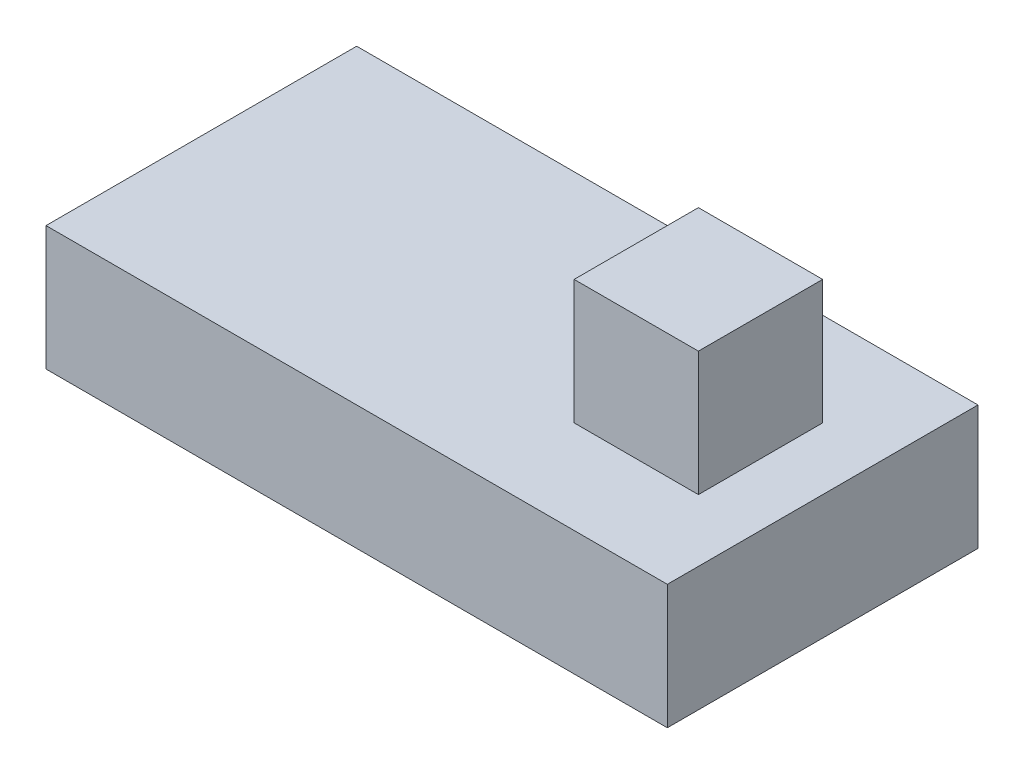
ISO-10303-21;
HEADER;
FILE_DESCRIPTION(('STEP AP214'),'2;1');
FILE_NAME('part.step','',(''),(''),'','','');
FILE_SCHEMA(('AUTOMOTIVE_DESIGN { 1 0 10303 214 1 1 1 1 }'));
ENDSEC;
DATA;
#1=APPLICATION_CONTEXT('core data for automotive mechanical design processes');
#2=APPLICATION_PROTOCOL_DEFINITION('international standard','automotive_design',2000,#1);
#3=PRODUCT_CONTEXT('',#1,'mechanical');
#4=PRODUCT('Part','Part','',(#3));
#5=PRODUCT_RELATED_PRODUCT_CATEGORY('part','',(#4));
#6=PRODUCT_DEFINITION_FORMATION('','',#4);
#7=PRODUCT_DEFINITION_CONTEXT('part definition',#1,'design');
#8=PRODUCT_DEFINITION('design','',#6,#7);
#9=PRODUCT_DEFINITION_SHAPE('','',#8);
#10=(LENGTH_UNIT() NAMED_UNIT(*) SI_UNIT(.MILLI.,.METRE.));
#11=(NAMED_UNIT(*) PLANE_ANGLE_UNIT() SI_UNIT($,.RADIAN.));
#12=(NAMED_UNIT(*) SI_UNIT($,.STERADIAN.) SOLID_ANGLE_UNIT());
#13=UNCERTAINTY_MEASURE_WITH_UNIT(LENGTH_MEASURE(1.E-05),#10,'distance_accuracy_value','');
#14=(GEOMETRIC_REPRESENTATION_CONTEXT(3) GLOBAL_UNCERTAINTY_ASSIGNED_CONTEXT((#13)) GLOBAL_UNIT_ASSIGNED_CONTEXT((#10,
#11,#12)) REPRESENTATION_CONTEXT('',''));
#15=CARTESIAN_POINT('',(0.,0.,0.));
#16=DIRECTION('',(0.,0.,1.));
#17=DIRECTION('',(1.,0.,0.));
#18=AXIS2_PLACEMENT_3D('',#15,#16,#17);
#19=CARTESIAN_POINT('',(0.,40.,0.));
#20=DIRECTION('',(0.,-1.,0.));
#21=DIRECTION('',(0.,0.,-1.));
#22=AXIS2_PLACEMENT_3D('',#19,#20,#21);
#23=PLANE('',#22);
#24=DIRECTION('',(0.,0.,1.));
#25=VECTOR('',#24,1.);
#26=CARTESIAN_POINT('',(0.,40.,0.));
#27=LINE('',#26,#25);
#28=CARTESIAN_POINT('',(0.,40.,-100.));
#29=VERTEX_POINT('',#28);
#30=CARTESIAN_POINT('',(0.,40.,0.));
#31=VERTEX_POINT('',#30);
#32=EDGE_CURVE('E140',#29,#31,#27,.T.);
#33=ORIENTED_EDGE('',*,*,#32,.T.);
#34=DIRECTION('',(1.,0.,0.));
#35=VECTOR('',#34,1.);
#36=CARTESIAN_POINT('',(0.,40.,0.));
#37=LINE('',#36,#35);
#38=CARTESIAN_POINT('',(200.,40.,0.));
#39=VERTEX_POINT('',#38);
#40=EDGE_CURVE('E144',#31,#39,#37,.T.);
#41=ORIENTED_EDGE('',*,*,#40,.T.);
#42=DIRECTION('',(0.,0.,-1.));
#43=VECTOR('',#42,1.);
#44=CARTESIAN_POINT('',(200.,40.,0.));
#45=LINE('',#44,#43);
#46=CARTESIAN_POINT('',(200.,40.,-100.));
#47=VERTEX_POINT('',#46);
#48=EDGE_CURVE('E148',#39,#47,#45,.T.);
#49=ORIENTED_EDGE('',*,*,#48,.T.);
#50=DIRECTION('',(-1.,0.,0.));
#51=VECTOR('',#50,1.);
#52=CARTESIAN_POINT('',(0.,40.,-100.));
#53=LINE('',#52,#51);
#54=EDGE_CURVE('E151',#47,#29,#53,.T.);
#55=ORIENTED_EDGE('',*,*,#54,.T.);
#56=EDGE_LOOP('',(#33,#41,#49,#55));
#57=FACE_BOUND('',#56,.T.);
#58=DIRECTION('',(0.,0.,1.));
#59=VECTOR('',#58,1.);
#60=CARTESIAN_POINT('',(140.,40.,-30.));
#61=LINE('',#60,#59);
#62=CARTESIAN_POINT('',(140.,40.,-70.));
#63=VERTEX_POINT('',#62);
#64=CARTESIAN_POINT('',(140.,40.,-30.));
#65=VERTEX_POINT('',#64);
#66=EDGE_CURVE('E127',#63,#65,#61,.T.);
#67=ORIENTED_EDGE('',*,*,#66,.F.);
#68=DIRECTION('',(-1.,0.,0.));
#69=VECTOR('',#68,1.);
#70=CARTESIAN_POINT('',(140.,40.,-70.));
#71=LINE('',#70,#69);
#72=CARTESIAN_POINT('',(180.,40.,-70.));
#73=VERTEX_POINT('',#72);
#74=EDGE_CURVE('E124',#73,#63,#71,.T.);
#75=ORIENTED_EDGE('',*,*,#74,.F.);
#76=DIRECTION('',(0.,0.,-1.));
#77=VECTOR('',#76,1.);
#78=CARTESIAN_POINT('',(180.,40.,-30.));
#79=LINE('',#78,#77);
#80=CARTESIAN_POINT('',(180.,40.,-30.));
#81=VERTEX_POINT('',#80);
#82=EDGE_CURVE('E60',#81,#73,#79,.T.);
#83=ORIENTED_EDGE('',*,*,#82,.F.);
#84=DIRECTION('',(1.,0.,0.));
#85=VECTOR('',#84,1.);
#86=CARTESIAN_POINT('',(140.,40.,-30.));
#87=LINE('',#86,#85);
#88=EDGE_CURVE('E55',#65,#81,#87,.T.);
#89=ORIENTED_EDGE('',*,*,#88,.F.);
#90=EDGE_LOOP('',(#67,#75,#83,#89));
#91=FACE_BOUND('',#90,.T.);
#92=ADVANCED_FACE('F39',(#57,#91),#23,.F.);
#93=CARTESIAN_POINT('',(0.,40.,0.));
#94=DIRECTION('',(1.,0.,0.));
#95=DIRECTION('',(0.,0.,-1.));
#96=AXIS2_PLACEMENT_3D('',#93,#94,#95);
#97=PLANE('',#96);
#98=DIRECTION('',(0.,0.,1.));
#99=VECTOR('',#98,1.);
#100=CARTESIAN_POINT('',(0.,0.,0.));
#101=LINE('',#100,#99);
#102=CARTESIAN_POINT('',(0.,0.,-100.));
#103=VERTEX_POINT('',#102);
#104=CARTESIAN_POINT('',(0.,0.,0.));
#105=VERTEX_POINT('',#104);
#106=EDGE_CURVE('E129',#103,#105,#101,.T.);
#107=ORIENTED_EDGE('',*,*,#106,.T.);
#108=DIRECTION('',(0.,-1.,0.));
#109=VECTOR('',#108,1.);
#110=CARTESIAN_POINT('',(0.,40.,0.));
#111=LINE('',#110,#109);
#112=EDGE_CURVE('E11',#31,#105,#111,.T.);
#113=ORIENTED_EDGE('',*,*,#112,.F.);
#114=ORIENTED_EDGE('',*,*,#32,.F.);
#115=DIRECTION('',(0.,-1.,0.));
#116=VECTOR('',#115,1.);
#117=CARTESIAN_POINT('',(0.,40.,-100.));
#118=LINE('',#117,#116);
#119=EDGE_CURVE('E153',#29,#103,#118,.T.);
#120=ORIENTED_EDGE('',*,*,#119,.T.);
#121=EDGE_LOOP('',(#107,#113,#114,#120));
#122=FACE_BOUND('',#121,.T.);
#123=ADVANCED_FACE('F41',(#122),#97,.F.);
#124=CARTESIAN_POINT('',(0.,40.,0.));
#125=DIRECTION('',(0.,0.,-1.));
#126=DIRECTION('',(-1.,0.,0.));
#127=AXIS2_PLACEMENT_3D('',#124,#125,#126);
#128=PLANE('',#127);
#129=DIRECTION('',(1.,0.,0.));
#130=VECTOR('',#129,1.);
#131=CARTESIAN_POINT('',(0.,0.,0.));
#132=LINE('',#131,#130);
#133=CARTESIAN_POINT('',(200.,0.,0.));
#134=VERTEX_POINT('',#133);
#135=EDGE_CURVE('E134',#105,#134,#132,.T.);
#136=ORIENTED_EDGE('',*,*,#135,.T.);
#137=DIRECTION('',(0.,-1.,0.));
#138=VECTOR('',#137,1.);
#139=CARTESIAN_POINT('',(200.,40.,0.));
#140=LINE('',#139,#138);
#141=EDGE_CURVE('E48',#39,#134,#140,.T.);
#142=ORIENTED_EDGE('',*,*,#141,.F.);
#143=ORIENTED_EDGE('',*,*,#40,.F.);
#144=ORIENTED_EDGE('',*,*,#112,.T.);
#145=EDGE_LOOP('',(#136,#142,#143,#144));
#146=FACE_BOUND('',#145,.T.);
#147=ADVANCED_FACE('F189',(#146),#128,.F.);
#148=CARTESIAN_POINT('',(200.,40.,0.));
#149=DIRECTION('',(-1.,0.,0.));
#150=DIRECTION('',(0.,0.,1.));
#151=AXIS2_PLACEMENT_3D('',#148,#149,#150);
#152=PLANE('',#151);
#153=DIRECTION('',(0.,0.,-1.));
#154=VECTOR('',#153,1.);
#155=CARTESIAN_POINT('',(200.,0.,0.));
#156=LINE('',#155,#154);
#157=CARTESIAN_POINT('',(200.,0.,-100.));
#158=VERTEX_POINT('',#157);
#159=EDGE_CURVE('E157',#134,#158,#156,.T.);
#160=ORIENTED_EDGE('',*,*,#159,.T.);
#161=DIRECTION('',(0.,-1.,0.));
#162=VECTOR('',#161,1.);
#163=CARTESIAN_POINT('',(200.,40.,-100.));
#164=LINE('',#163,#162);
#165=EDGE_CURVE('E165',#47,#158,#164,.T.);
#166=ORIENTED_EDGE('',*,*,#165,.F.);
#167=ORIENTED_EDGE('',*,*,#48,.F.);
#168=ORIENTED_EDGE('',*,*,#141,.T.);
#169=EDGE_LOOP('',(#160,#166,#167,#168));
#170=FACE_BOUND('',#169,.T.);
#171=ADVANCED_FACE('F174',(#170),#152,.F.);
#172=CARTESIAN_POINT('',(0.,40.,-100.));
#173=DIRECTION('',(0.,0.,1.));
#174=DIRECTION('',(1.,0.,0.));
#175=AXIS2_PLACEMENT_3D('',#172,#173,#174);
#176=PLANE('',#175);
#177=DIRECTION('',(-1.,0.,0.));
#178=VECTOR('',#177,1.);
#179=CARTESIAN_POINT('',(0.,0.,-100.));
#180=LINE('',#179,#178);
#181=EDGE_CURVE('E145',#158,#103,#180,.T.);
#182=ORIENTED_EDGE('',*,*,#181,.T.);
#183=ORIENTED_EDGE('',*,*,#119,.F.);
#184=ORIENTED_EDGE('',*,*,#54,.F.);
#185=ORIENTED_EDGE('',*,*,#165,.T.);
#186=EDGE_LOOP('',(#182,#183,#184,#185));
#187=FACE_BOUND('',#186,.T.);
#188=ADVANCED_FACE('F183',(#187),#176,.F.);
#189=CARTESIAN_POINT('',(0.,0.,0.));
#190=DIRECTION('',(0.,-1.,0.));
#191=DIRECTION('',(0.,0.,-1.));
#192=AXIS2_PLACEMENT_3D('',#189,#190,#191);
#193=PLANE('',#192);
#194=ORIENTED_EDGE('',*,*,#106,.F.);
#195=ORIENTED_EDGE('',*,*,#181,.F.);
#196=ORIENTED_EDGE('',*,*,#159,.F.);
#197=ORIENTED_EDGE('',*,*,#135,.F.);
#198=EDGE_LOOP('',(#194,#195,#196,#197));
#199=FACE_BOUND('',#198,.T.);
#200=ADVANCED_FACE('F180',(#199),#193,.T.);
#201=CARTESIAN_POINT('',(140.,80.,-30.));
#202=DIRECTION('',(1.,0.,0.));
#203=DIRECTION('',(0.,0.,-1.));
#204=AXIS2_PLACEMENT_3D('',#201,#202,#203);
#205=PLANE('',#204);
#206=ORIENTED_EDGE('',*,*,#66,.T.);
#207=DIRECTION('',(0.,-1.,0.));
#208=VECTOR('',#207,1.);
#209=CARTESIAN_POINT('',(140.,80.,-30.));
#210=LINE('',#209,#208);
#211=CARTESIAN_POINT('',(140.,80.,-30.));
#212=VERTEX_POINT('',#211);
#213=EDGE_CURVE('E106',#212,#65,#210,.T.);
#214=ORIENTED_EDGE('',*,*,#213,.F.);
#215=DIRECTION('',(0.,0.,1.));
#216=VECTOR('',#215,1.);
#217=CARTESIAN_POINT('',(140.,80.,-30.));
#218=LINE('',#217,#216);
#219=CARTESIAN_POINT('',(140.,80.,-70.));
#220=VERTEX_POINT('',#219);
#221=EDGE_CURVE('E114',#220,#212,#218,.T.);
#222=ORIENTED_EDGE('',*,*,#221,.F.);
#223=DIRECTION('',(0.,-1.,0.));
#224=VECTOR('',#223,1.);
#225=CARTESIAN_POINT('',(140.,80.,-70.));
#226=LINE('',#225,#224);
#227=EDGE_CURVE('E282',#220,#63,#226,.T.);
#228=ORIENTED_EDGE('',*,*,#227,.T.);
#229=EDGE_LOOP('',(#206,#214,#222,#228));
#230=FACE_BOUND('',#229,.T.);
#231=ADVANCED_FACE('F126',(#230),#205,.F.);
#232=CARTESIAN_POINT('',(140.,80.,-30.));
#233=DIRECTION('',(0.,0.,-1.));
#234=DIRECTION('',(-1.,0.,0.));
#235=AXIS2_PLACEMENT_3D('',#232,#233,#234);
#236=PLANE('',#235);
#237=ORIENTED_EDGE('',*,*,#88,.T.);
#238=DIRECTION('',(0.,-1.,0.));
#239=VECTOR('',#238,1.);
#240=CARTESIAN_POINT('',(180.,80.,-30.));
#241=LINE('',#240,#239);
#242=CARTESIAN_POINT('',(180.,80.,-30.));
#243=VERTEX_POINT('',#242);
#244=EDGE_CURVE('E109',#243,#81,#241,.T.);
#245=ORIENTED_EDGE('',*,*,#244,.F.);
#246=DIRECTION('',(1.,0.,0.));
#247=VECTOR('',#246,1.);
#248=CARTESIAN_POINT('',(140.,80.,-30.));
#249=LINE('',#248,#247);
#250=EDGE_CURVE('E102',#212,#243,#249,.T.);
#251=ORIENTED_EDGE('',*,*,#250,.F.);
#252=ORIENTED_EDGE('',*,*,#213,.T.);
#253=EDGE_LOOP('',(#237,#245,#251,#252));
#254=FACE_BOUND('',#253,.T.);
#255=ADVANCED_FACE('F104',(#254),#236,.F.);
#256=CARTESIAN_POINT('',(180.,80.,-30.));
#257=DIRECTION('',(-1.,0.,0.));
#258=DIRECTION('',(0.,0.,1.));
#259=AXIS2_PLACEMENT_3D('',#256,#257,#258);
#260=PLANE('',#259);
#261=ORIENTED_EDGE('',*,*,#82,.T.);
#262=DIRECTION('',(0.,-1.,0.));
#263=VECTOR('',#262,1.);
#264=CARTESIAN_POINT('',(180.,80.,-70.));
#265=LINE('',#264,#263);
#266=CARTESIAN_POINT('',(180.,80.,-70.));
#267=VERTEX_POINT('',#266);
#268=EDGE_CURVE('E136',#267,#73,#265,.T.);
#269=ORIENTED_EDGE('',*,*,#268,.F.);
#270=DIRECTION('',(0.,0.,-1.));
#271=VECTOR('',#270,1.);
#272=CARTESIAN_POINT('',(180.,80.,-30.));
#273=LINE('',#272,#271);
#274=EDGE_CURVE('E113',#243,#267,#273,.T.);
#275=ORIENTED_EDGE('',*,*,#274,.F.);
#276=ORIENTED_EDGE('',*,*,#244,.T.);
#277=EDGE_LOOP('',(#261,#269,#275,#276));
#278=FACE_BOUND('',#277,.T.);
#279=ADVANCED_FACE('F225',(#278),#260,.F.);
#280=CARTESIAN_POINT('',(140.,80.,-70.));
#281=DIRECTION('',(0.,0.,1.));
#282=DIRECTION('',(1.,0.,0.));
#283=AXIS2_PLACEMENT_3D('',#280,#281,#282);
#284=PLANE('',#283);
#285=ORIENTED_EDGE('',*,*,#74,.T.);
#286=ORIENTED_EDGE('',*,*,#227,.F.);
#287=DIRECTION('',(-1.,0.,0.));
#288=VECTOR('',#287,1.);
#289=CARTESIAN_POINT('',(140.,80.,-70.));
#290=LINE('',#289,#288);
#291=EDGE_CURVE('E119',#267,#220,#290,.T.);
#292=ORIENTED_EDGE('',*,*,#291,.F.);
#293=ORIENTED_EDGE('',*,*,#268,.T.);
#294=EDGE_LOOP('',(#285,#286,#292,#293));
#295=FACE_BOUND('',#294,.T.);
#296=ADVANCED_FACE('F231',(#295),#284,.F.);
#297=CARTESIAN_POINT('',(0.,80.,0.));
#298=DIRECTION('',(0.,-1.,0.));
#299=DIRECTION('',(0.,0.,-1.));
#300=AXIS2_PLACEMENT_3D('',#297,#298,#299);
#301=PLANE('',#300);
#302=ORIENTED_EDGE('',*,*,#221,.T.);
#303=ORIENTED_EDGE('',*,*,#250,.T.);
#304=ORIENTED_EDGE('',*,*,#274,.T.);
#305=ORIENTED_EDGE('',*,*,#291,.T.);
#306=EDGE_LOOP('',(#302,#303,#304,#305));
#307=FACE_BOUND('',#306,.T.);
#308=ADVANCED_FACE('F117',(#307),#301,.F.);
#309=CLOSED_SHELL('',(#92,#123,#147,#171,#188,#200,#231,#255,#279,#296,#308));
#310=MANIFOLD_SOLID_BREP('B2',#309);
#311=ADVANCED_BREP_SHAPE_REPRESENTATION('',(#18,#310),#14);
#312=SHAPE_DEFINITION_REPRESENTATION(#9,#311);
ENDSEC;
END-ISO-10303-21;
